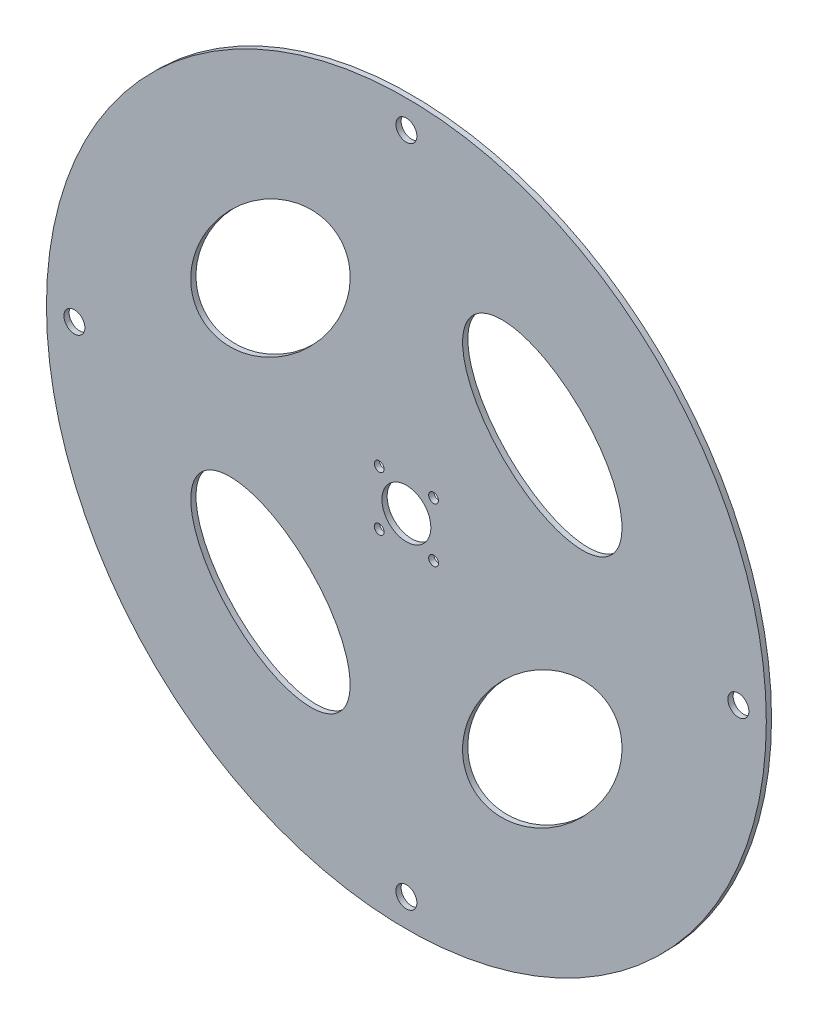
ISO-10303-21;
HEADER;
FILE_DESCRIPTION(('STEP AP214'),'2;1');
FILE_NAME('part.step','',(''),(''),'','','');
FILE_SCHEMA(('AUTOMOTIVE_DESIGN { 1 0 10303 214 1 1 1 1 }'));
ENDSEC;
DATA;
#1=APPLICATION_CONTEXT('core data for automotive mechanical design processes');
#2=APPLICATION_PROTOCOL_DEFINITION('international standard','automotive_design',2000,#1);
#3=PRODUCT_CONTEXT('',#1,'mechanical');
#4=PRODUCT('Part','Part','',(#3));
#5=PRODUCT_RELATED_PRODUCT_CATEGORY('part','',(#4));
#6=PRODUCT_DEFINITION_FORMATION('','',#4);
#7=PRODUCT_DEFINITION_CONTEXT('part definition',#1,'design');
#8=PRODUCT_DEFINITION('design','',#6,#7);
#9=PRODUCT_DEFINITION_SHAPE('','',#8);
#10=(LENGTH_UNIT() NAMED_UNIT(*) SI_UNIT(.MILLI.,.METRE.));
#11=(NAMED_UNIT(*) PLANE_ANGLE_UNIT() SI_UNIT($,.RADIAN.));
#12=(NAMED_UNIT(*) SI_UNIT($,.STERADIAN.) SOLID_ANGLE_UNIT());
#13=UNCERTAINTY_MEASURE_WITH_UNIT(LENGTH_MEASURE(1.E-05),#10,'distance_accuracy_value','');
#14=(GEOMETRIC_REPRESENTATION_CONTEXT(3) GLOBAL_UNCERTAINTY_ASSIGNED_CONTEXT((#13)) GLOBAL_UNIT_ASSIGNED_CONTEXT((#10,
#11,#12)) REPRESENTATION_CONTEXT('',''));
#15=CARTESIAN_POINT('',(0.,0.,0.));
#16=DIRECTION('',(0.,0.,1.));
#17=DIRECTION('',(1.,0.,0.));
#18=AXIS2_PLACEMENT_3D('',#15,#16,#17);
#19=CARTESIAN_POINT('',(0.,0.,1.5));
#20=DIRECTION('',(0.,0.,-1.));
#21=DIRECTION('',(-1.,0.,0.));
#22=AXIS2_PLACEMENT_3D('',#19,#20,#21);
#23=CYLINDRICAL_SURFACE('',#22,103.);
#24=CARTESIAN_POINT('',(0.,0.,1.5));
#25=DIRECTION('',(0.,0.,1.));
#26=DIRECTION('',(1.,0.,0.));
#27=AXIS2_PLACEMENT_3D('',#24,#25,#26);
#28=CIRCLE('',#27,103.);
#29=CARTESIAN_POINT('',(103.,0.,1.5));
#30=VERTEX_POINT('',#29);
#31=EDGE_CURVE('E10',#30,#30,#28,.T.);
#32=ORIENTED_EDGE('',*,*,#31,.F.);
#33=EDGE_LOOP('',(#32));
#34=FACE_BOUND('',#33,.T.);
#35=CARTESIAN_POINT('',(0.,0.,0.));
#36=DIRECTION('',(0.,0.,1.));
#37=DIRECTION('',(1.,0.,0.));
#38=AXIS2_PLACEMENT_3D('',#35,#36,#37);
#39=CIRCLE('',#38,103.);
#40=CARTESIAN_POINT('',(103.,0.,0.));
#41=VERTEX_POINT('',#40);
#42=EDGE_CURVE('E37',#41,#41,#39,.T.);
#43=ORIENTED_EDGE('',*,*,#42,.T.);
#44=EDGE_LOOP('',(#43));
#45=FACE_BOUND('',#44,.T.);
#46=ADVANCED_FACE('F40',(#34,#45),#23,.T.);
#47=CARTESIAN_POINT('',(0.,0.,1.5));
#48=DIRECTION('',(0.,0.,1.));
#49=DIRECTION('',(1.,0.,0.));
#50=AXIS2_PLACEMENT_3D('',#47,#48,#49);
#51=PLANE('',#50);
#52=CARTESIAN_POINT('',(7.77817459305194,-7.7781745930521,1.5));
#53=DIRECTION('',(0.,0.,1.));
#54=DIRECTION('',(1.,0.,0.));
#55=AXIS2_PLACEMENT_3D('',#52,#53,#54);
#56=CIRCLE('',#55,1.4);
#57=CARTESIAN_POINT('',(9.17817459305194,-7.7781745930521,1.5));
#58=VERTEX_POINT('',#57);
#59=EDGE_CURVE('E105',#58,#58,#56,.T.);
#60=ORIENTED_EDGE('',*,*,#59,.F.);
#61=EDGE_LOOP('',(#60));
#62=FACE_BOUND('',#61,.T.);
#63=CARTESIAN_POINT('',(7.77817459305208,7.77817459305197,1.5));
#64=DIRECTION('',(0.,0.,1.));
#65=DIRECTION('',(1.,0.,0.));
#66=AXIS2_PLACEMENT_3D('',#63,#64,#65);
#67=CIRCLE('',#66,1.4);
#68=CARTESIAN_POINT('',(9.17817459305208,7.77817459305197,1.5));
#69=VERTEX_POINT('',#68);
#70=EDGE_CURVE('E112',#69,#69,#67,.T.);
#71=ORIENTED_EDGE('',*,*,#70,.F.);
#72=EDGE_LOOP('',(#71));
#73=FACE_BOUND('',#72,.T.);
#74=CARTESIAN_POINT('',(-7.77817459305199,7.77817459305205,1.5));
#75=DIRECTION('',(0.,0.,1.));
#76=DIRECTION('',(1.,0.,0.));
#77=AXIS2_PLACEMENT_3D('',#74,#75,#76);
#78=CIRCLE('',#77,1.4);
#79=CARTESIAN_POINT('',(-6.378174593052,7.77817459305205,1.5));
#80=VERTEX_POINT('',#79);
#81=EDGE_CURVE('E110',#80,#80,#78,.T.);
#82=ORIENTED_EDGE('',*,*,#81,.F.);
#83=EDGE_LOOP('',(#82));
#84=FACE_BOUND('',#83,.T.);
#85=CARTESIAN_POINT('',(-7.77817459305202,-7.77817459305202,1.5));
#86=DIRECTION('',(0.,0.,1.));
#87=DIRECTION('',(1.,0.,0.));
#88=AXIS2_PLACEMENT_3D('',#85,#86,#87);
#89=CIRCLE('',#88,1.4);
#90=CARTESIAN_POINT('',(-6.37817459305202,-7.77817459305202,1.5));
#91=VERTEX_POINT('',#90);
#92=EDGE_CURVE('E125',#91,#91,#89,.T.);
#93=ORIENTED_EDGE('',*,*,#92,.F.);
#94=EDGE_LOOP('',(#93));
#95=FACE_BOUND('',#94,.T.);
#96=CARTESIAN_POINT('',(38.8908729652602,38.89087296526,1.5));
#97=DIRECTION('',(0.,0.,-1.));
#98=DIRECTION('',(0.707106781186545,-0.70710678118655,0.));
#99=AXIS2_PLACEMENT_3D('',#96,#97,#98);
#100=ELLIPSE('',#99,28.,16.);
#101=CARTESIAN_POINT('',(58.6898628384835,19.0918830920366,1.5));
#102=VERTEX_POINT('',#101);
#103=EDGE_CURVE('E127',#102,#102,#100,.T.);
#104=ORIENTED_EDGE('',*,*,#103,.T.);
#105=EDGE_LOOP('',(#104));
#106=FACE_BOUND('',#105,.T.);
#107=CARTESIAN_POINT('',(38.8908729652601,-38.8908729652601,1.5));
#108=DIRECTION('',(0.,0.,-1.));
#109=DIRECTION('',(-0.707106781186547,-0.707106781186548,0.));
#110=AXIS2_PLACEMENT_3D('',#107,#108,#109);
#111=ELLIPSE('',#110,28.,16.);
#112=CARTESIAN_POINT('',(19.0918830920368,-58.6898628384834,1.5));
#113=VERTEX_POINT('',#112);
#114=EDGE_CURVE('E149',#113,#113,#111,.T.);
#115=ORIENTED_EDGE('',*,*,#114,.T.);
#116=EDGE_LOOP('',(#115));
#117=FACE_BOUND('',#116,.T.);
#118=CARTESIAN_POINT('',(-38.8908729652605,-38.8908729652597,1.5));
#119=DIRECTION('',(0.,0.,-1.));
#120=DIRECTION('',(-0.70710678118654,0.707106781186555,0.));
#121=AXIS2_PLACEMENT_3D('',#118,#119,#120);
#122=ELLIPSE('',#121,28.,16.);
#123=CARTESIAN_POINT('',(-58.6898628384836,-19.0918830920362,1.5));
#124=VERTEX_POINT('',#123);
#125=EDGE_CURVE('E154',#124,#124,#122,.T.);
#126=ORIENTED_EDGE('',*,*,#125,.T.);
#127=EDGE_LOOP('',(#126));
#128=FACE_BOUND('',#127,.T.);
#129=CARTESIAN_POINT('',(3.31690727190098E-13,95.,1.5));
#130=DIRECTION('',(0.,0.,-1.));
#131=DIRECTION('',(0.,1.,0.));
#132=AXIS2_PLACEMENT_3D('',#129,#130,#131);
#133=CIRCLE('',#132,3.00000000000001);
#134=CARTESIAN_POINT('',(3.42165171206627E-13,98.,1.5));
#135=VERTEX_POINT('',#134);
#136=EDGE_CURVE('E59',#135,#135,#133,.T.);
#137=ORIENTED_EDGE('',*,*,#136,.T.);
#138=EDGE_LOOP('',(#137));
#139=FACE_BOUND('',#138,.T.);
#140=CARTESIAN_POINT('',(95.,0.,1.5));
#141=DIRECTION('',(0.,0.,-1.));
#142=DIRECTION('',(1.,0.,0.));
#143=AXIS2_PLACEMENT_3D('',#140,#141,#142);
#144=CIRCLE('',#143,3.00000000000001);
#145=CARTESIAN_POINT('',(98.,0.,1.5));
#146=VERTEX_POINT('',#145);
#147=EDGE_CURVE('E166',#146,#146,#144,.T.);
#148=ORIENTED_EDGE('',*,*,#147,.T.);
#149=EDGE_LOOP('',(#148));
#150=FACE_BOUND('',#149,.T.);
#151=CARTESIAN_POINT('',(-9.95072181570293E-13,-95.,1.5));
#152=DIRECTION('',(0.,0.,-1.));
#153=DIRECTION('',(0.,-1.,0.));
#154=AXIS2_PLACEMENT_3D('',#151,#152,#153);
#155=CIRCLE('',#154,3.00000000000001);
#156=CARTESIAN_POINT('',(-1.02649551361988E-12,-98.,1.5));
#157=VERTEX_POINT('',#156);
#158=EDGE_CURVE('E172',#157,#157,#155,.T.);
#159=ORIENTED_EDGE('',*,*,#158,.T.);
#160=EDGE_LOOP('',(#159));
#161=FACE_BOUND('',#160,.T.);
#162=CARTESIAN_POINT('',(-38.8908729652601,38.8908729652601,1.5));
#163=DIRECTION('',(0.,0.,-1.));
#164=DIRECTION('',(0.707106781186547,0.707106781186548,0.));
#165=AXIS2_PLACEMENT_3D('',#162,#163,#164);
#166=ELLIPSE('',#165,28.,16.);
#167=CARTESIAN_POINT('',(-19.0918830920368,58.6898628384834,1.5));
#168=VERTEX_POINT('',#167);
#169=EDGE_CURVE('E55',#168,#168,#166,.T.);
#170=ORIENTED_EDGE('',*,*,#169,.T.);
#171=EDGE_LOOP('',(#170));
#172=FACE_BOUND('',#171,.T.);
#173=CARTESIAN_POINT('',(-95.,0.,1.5));
#174=DIRECTION('',(0.,0.,-1.));
#175=DIRECTION('',(-1.,0.,0.));
#176=AXIS2_PLACEMENT_3D('',#173,#174,#175);
#177=CIRCLE('',#176,3.00000000000001);
#178=CARTESIAN_POINT('',(-98.,0.,1.5));
#179=VERTEX_POINT('',#178);
#180=EDGE_CURVE('E50',#179,#179,#177,.T.);
#181=ORIENTED_EDGE('',*,*,#180,.T.);
#182=EDGE_LOOP('',(#181));
#183=FACE_BOUND('',#182,.T.);
#184=ORIENTED_EDGE('',*,*,#31,.T.);
#185=EDGE_LOOP('',(#184));
#186=FACE_BOUND('',#185,.T.);
#187=CARTESIAN_POINT('',(0.,0.,1.5));
#188=DIRECTION('',(0.,0.,1.));
#189=DIRECTION('',(1.,0.,0.));
#190=AXIS2_PLACEMENT_3D('',#187,#188,#189);
#191=CIRCLE('',#190,7.);
#192=CARTESIAN_POINT('',(7.,0.,1.5));
#193=VERTEX_POINT('',#192);
#194=EDGE_CURVE('E99',#193,#193,#191,.T.);
#195=ORIENTED_EDGE('',*,*,#194,.F.);
#196=EDGE_LOOP('',(#195));
#197=FACE_BOUND('',#196,.T.);
#198=ADVANCED_FACE('F80',(#62,#73,#84,#95,#106,#117,#128,#139,#150,#161,#172,#183,#186,#197),
#51,.T.);
#199=CARTESIAN_POINT('',(0.,0.,0.));
#200=DIRECTION('',(0.,0.,1.));
#201=DIRECTION('',(1.,0.,0.));
#202=AXIS2_PLACEMENT_3D('',#199,#200,#201);
#203=PLANE('',#202);
#204=CARTESIAN_POINT('',(7.77817459305194,-7.7781745930521,0.));
#205=DIRECTION('',(0.,0.,1.));
#206=DIRECTION('',(1.,0.,0.));
#207=AXIS2_PLACEMENT_3D('',#204,#205,#206);
#208=CIRCLE('',#207,1.4);
#209=CARTESIAN_POINT('',(9.17817459305194,-7.7781745930521,0.));
#210=VERTEX_POINT('',#209);
#211=EDGE_CURVE('E118',#210,#210,#208,.T.);
#212=ORIENTED_EDGE('',*,*,#211,.T.);
#213=EDGE_LOOP('',(#212));
#214=FACE_BOUND('',#213,.T.);
#215=CARTESIAN_POINT('',(7.77817459305208,7.77817459305197,0.));
#216=DIRECTION('',(0.,0.,1.));
#217=DIRECTION('',(1.,0.,0.));
#218=AXIS2_PLACEMENT_3D('',#215,#216,#217);
#219=CIRCLE('',#218,1.4);
#220=CARTESIAN_POINT('',(9.17817459305208,7.77817459305197,0.));
#221=VERTEX_POINT('',#220);
#222=EDGE_CURVE('E115',#221,#221,#219,.T.);
#223=ORIENTED_EDGE('',*,*,#222,.T.);
#224=EDGE_LOOP('',(#223));
#225=FACE_BOUND('',#224,.T.);
#226=CARTESIAN_POINT('',(-7.77817459305199,7.77817459305205,0.));
#227=DIRECTION('',(0.,0.,1.));
#228=DIRECTION('',(1.,0.,0.));
#229=AXIS2_PLACEMENT_3D('',#226,#227,#228);
#230=CIRCLE('',#229,1.4);
#231=CARTESIAN_POINT('',(-6.378174593052,7.77817459305205,0.));
#232=VERTEX_POINT('',#231);
#233=EDGE_CURVE('E104',#232,#232,#230,.T.);
#234=ORIENTED_EDGE('',*,*,#233,.T.);
#235=EDGE_LOOP('',(#234));
#236=FACE_BOUND('',#235,.T.);
#237=CARTESIAN_POINT('',(-7.77817459305202,-7.77817459305202,0.));
#238=DIRECTION('',(0.,0.,1.));
#239=DIRECTION('',(1.,0.,0.));
#240=AXIS2_PLACEMENT_3D('',#237,#238,#239);
#241=CIRCLE('',#240,1.4);
#242=CARTESIAN_POINT('',(-6.37817459305202,-7.77817459305202,0.));
#243=VERTEX_POINT('',#242);
#244=EDGE_CURVE('E106',#243,#243,#241,.T.);
#245=ORIENTED_EDGE('',*,*,#244,.T.);
#246=EDGE_LOOP('',(#245));
#247=FACE_BOUND('',#246,.T.);
#248=CARTESIAN_POINT('',(38.8908729652602,38.89087296526,0.));
#249=DIRECTION('',(0.,0.,-1.));
#250=DIRECTION('',(0.707106781186545,-0.70710678118655,0.));
#251=AXIS2_PLACEMENT_3D('',#248,#249,#250);
#252=ELLIPSE('',#251,28.,16.);
#253=CARTESIAN_POINT('',(58.6898628384835,19.0918830920366,0.));
#254=VERTEX_POINT('',#253);
#255=EDGE_CURVE('E135',#254,#254,#252,.T.);
#256=ORIENTED_EDGE('',*,*,#255,.F.);
#257=EDGE_LOOP('',(#256));
#258=FACE_BOUND('',#257,.T.);
#259=CARTESIAN_POINT('',(38.8908729652601,-38.8908729652601,0.));
#260=DIRECTION('',(0.,0.,-1.));
#261=DIRECTION('',(-0.707106781186547,-0.707106781186548,0.));
#262=AXIS2_PLACEMENT_3D('',#259,#260,#261);
#263=ELLIPSE('',#262,28.,16.);
#264=CARTESIAN_POINT('',(19.0918830920368,-58.6898628384834,0.));
#265=VERTEX_POINT('',#264);
#266=EDGE_CURVE('E152',#265,#265,#263,.T.);
#267=ORIENTED_EDGE('',*,*,#266,.F.);
#268=EDGE_LOOP('',(#267));
#269=FACE_BOUND('',#268,.T.);
#270=CARTESIAN_POINT('',(-38.8908729652605,-38.8908729652597,0.));
#271=DIRECTION('',(0.,0.,-1.));
#272=DIRECTION('',(-0.70710678118654,0.707106781186555,0.));
#273=AXIS2_PLACEMENT_3D('',#270,#271,#272);
#274=ELLIPSE('',#273,28.,16.);
#275=CARTESIAN_POINT('',(-58.6898628384836,-19.0918830920362,0.));
#276=VERTEX_POINT('',#275);
#277=EDGE_CURVE('E124',#276,#276,#274,.T.);
#278=ORIENTED_EDGE('',*,*,#277,.F.);
#279=EDGE_LOOP('',(#278));
#280=FACE_BOUND('',#279,.T.);
#281=CARTESIAN_POINT('',(3.31690727190098E-13,95.,0.));
#282=DIRECTION('',(0.,0.,-1.));
#283=DIRECTION('',(0.,1.,0.));
#284=AXIS2_PLACEMENT_3D('',#281,#282,#283);
#285=CIRCLE('',#284,3.00000000000001);
#286=CARTESIAN_POINT('',(3.42165171206627E-13,98.,0.));
#287=VERTEX_POINT('',#286);
#288=EDGE_CURVE('E165',#287,#287,#285,.T.);
#289=ORIENTED_EDGE('',*,*,#288,.F.);
#290=EDGE_LOOP('',(#289));
#291=FACE_BOUND('',#290,.T.);
#292=CARTESIAN_POINT('',(95.,0.,0.));
#293=DIRECTION('',(0.,0.,-1.));
#294=DIRECTION('',(1.,0.,0.));
#295=AXIS2_PLACEMENT_3D('',#292,#293,#294);
#296=CIRCLE('',#295,3.00000000000001);
#297=CARTESIAN_POINT('',(98.,0.,0.));
#298=VERTEX_POINT('',#297);
#299=EDGE_CURVE('E168',#298,#298,#296,.T.);
#300=ORIENTED_EDGE('',*,*,#299,.F.);
#301=EDGE_LOOP('',(#300));
#302=FACE_BOUND('',#301,.T.);
#303=CARTESIAN_POINT('',(-9.95072181570293E-13,-95.,0.));
#304=DIRECTION('',(0.,0.,-1.));
#305=DIRECTION('',(0.,-1.,0.));
#306=AXIS2_PLACEMENT_3D('',#303,#304,#305);
#307=CIRCLE('',#306,3.00000000000001);
#308=CARTESIAN_POINT('',(-1.02649551361988E-12,-98.,0.));
#309=VERTEX_POINT('',#308);
#310=EDGE_CURVE('E61',#309,#309,#307,.T.);
#311=ORIENTED_EDGE('',*,*,#310,.F.);
#312=EDGE_LOOP('',(#311));
#313=FACE_BOUND('',#312,.T.);
#314=CARTESIAN_POINT('',(-38.8908729652601,38.8908729652601,0.));
#315=DIRECTION('',(0.,0.,-1.));
#316=DIRECTION('',(0.707106781186547,0.707106781186548,0.));
#317=AXIS2_PLACEMENT_3D('',#314,#315,#316);
#318=ELLIPSE('',#317,28.,16.);
#319=CARTESIAN_POINT('',(-19.0918830920368,58.6898628384834,0.));
#320=VERTEX_POINT('',#319);
#321=EDGE_CURVE('E54',#320,#320,#318,.T.);
#322=ORIENTED_EDGE('',*,*,#321,.F.);
#323=EDGE_LOOP('',(#322));
#324=FACE_BOUND('',#323,.T.);
#325=CARTESIAN_POINT('',(-95.,0.,0.));
#326=DIRECTION('',(0.,0.,-1.));
#327=DIRECTION('',(-1.,0.,0.));
#328=AXIS2_PLACEMENT_3D('',#325,#326,#327);
#329=CIRCLE('',#328,3.00000000000001);
#330=CARTESIAN_POINT('',(-98.,0.,0.));
#331=VERTEX_POINT('',#330);
#332=EDGE_CURVE('E47',#331,#331,#329,.T.);
#333=ORIENTED_EDGE('',*,*,#332,.F.);
#334=EDGE_LOOP('',(#333));
#335=FACE_BOUND('',#334,.T.);
#336=ORIENTED_EDGE('',*,*,#42,.F.);
#337=EDGE_LOOP('',(#336));
#338=FACE_BOUND('',#337,.T.);
#339=CARTESIAN_POINT('',(0.,0.,0.));
#340=DIRECTION('',(0.,0.,1.));
#341=DIRECTION('',(1.,0.,0.));
#342=AXIS2_PLACEMENT_3D('',#339,#340,#341);
#343=CIRCLE('',#342,7.);
#344=CARTESIAN_POINT('',(7.,0.,0.));
#345=VERTEX_POINT('',#344);
#346=EDGE_CURVE('E100',#345,#345,#343,.T.);
#347=ORIENTED_EDGE('',*,*,#346,.T.);
#348=EDGE_LOOP('',(#347));
#349=FACE_BOUND('',#348,.T.);
#350=ADVANCED_FACE('F71',(#214,#225,#236,#247,#258,#269,#280,#291,#302,#313,#324,#335,#338,
#349),#203,.F.);
#351=CARTESIAN_POINT('',(-95.,0.,1.5));
#352=DIRECTION('',(0.,0.,-1.));
#353=DIRECTION('',(-1.,0.,0.));
#354=AXIS2_PLACEMENT_3D('',#351,#352,#353);
#355=CYLINDRICAL_SURFACE('',#354,3.00000000000001);
#356=ORIENTED_EDGE('',*,*,#180,.F.);
#357=EDGE_LOOP('',(#356));
#358=FACE_BOUND('',#357,.T.);
#359=ORIENTED_EDGE('',*,*,#332,.T.);
#360=EDGE_LOOP('',(#359));
#361=FACE_BOUND('',#360,.T.);
#362=ADVANCED_FACE('F69',(#358,#361),#355,.F.);
#363=DIRECTION('',(0.,0.,-1.));
#364=VECTOR('',#363,1.);
#365=SURFACE_OF_LINEAR_EXTRUSION('',#166,#364);
#366=ORIENTED_EDGE('',*,*,#169,.F.);
#367=EDGE_LOOP('',(#366));
#368=FACE_BOUND('',#367,.T.);
#369=ORIENTED_EDGE('',*,*,#321,.T.);
#370=EDGE_LOOP('',(#369));
#371=FACE_BOUND('',#370,.T.);
#372=ADVANCED_FACE('F62',(#368,#371),#365,.F.);
#373=CARTESIAN_POINT('',(-9.95072181570293E-13,-95.,1.5));
#374=DIRECTION('',(0.,0.,-1.));
#375=DIRECTION('',(-1.,0.,0.));
#376=AXIS2_PLACEMENT_3D('',#373,#374,#375);
#377=CYLINDRICAL_SURFACE('',#376,3.00000000000001);
#378=ORIENTED_EDGE('',*,*,#158,.F.);
#379=EDGE_LOOP('',(#378));
#380=FACE_BOUND('',#379,.T.);
#381=ORIENTED_EDGE('',*,*,#310,.T.);
#382=EDGE_LOOP('',(#381));
#383=FACE_BOUND('',#382,.T.);
#384=ADVANCED_FACE('F68',(#380,#383),#377,.F.);
#385=CARTESIAN_POINT('',(95.,0.,1.5));
#386=DIRECTION('',(0.,0.,-1.));
#387=DIRECTION('',(-1.,0.,0.));
#388=AXIS2_PLACEMENT_3D('',#385,#386,#387);
#389=CYLINDRICAL_SURFACE('',#388,3.00000000000001);
#390=ORIENTED_EDGE('',*,*,#147,.F.);
#391=EDGE_LOOP('',(#390));
#392=FACE_BOUND('',#391,.T.);
#393=ORIENTED_EDGE('',*,*,#299,.T.);
#394=EDGE_LOOP('',(#393));
#395=FACE_BOUND('',#394,.T.);
#396=ADVANCED_FACE('F188',(#392,#395),#389,.F.);
#397=CARTESIAN_POINT('',(3.31690727190098E-13,95.,1.5));
#398=DIRECTION('',(0.,0.,-1.));
#399=DIRECTION('',(-1.,0.,0.));
#400=AXIS2_PLACEMENT_3D('',#397,#398,#399);
#401=CYLINDRICAL_SURFACE('',#400,3.00000000000001);
#402=ORIENTED_EDGE('',*,*,#136,.F.);
#403=EDGE_LOOP('',(#402));
#404=FACE_BOUND('',#403,.T.);
#405=ORIENTED_EDGE('',*,*,#288,.T.);
#406=EDGE_LOOP('',(#405));
#407=FACE_BOUND('',#406,.T.);
#408=ADVANCED_FACE('F191',(#404,#407),#401,.F.);
#409=DIRECTION('',(0.,0.,-1.));
#410=VECTOR('',#409,1.);
#411=SURFACE_OF_LINEAR_EXTRUSION('',#122,#410);
#412=ORIENTED_EDGE('',*,*,#125,.F.);
#413=EDGE_LOOP('',(#412));
#414=FACE_BOUND('',#413,.T.);
#415=ORIENTED_EDGE('',*,*,#277,.T.);
#416=EDGE_LOOP('',(#415));
#417=FACE_BOUND('',#416,.T.);
#418=ADVANCED_FACE('F144',(#414,#417),#411,.F.);
#419=DIRECTION('',(0.,0.,-1.));
#420=VECTOR('',#419,1.);
#421=SURFACE_OF_LINEAR_EXTRUSION('',#111,#420);
#422=ORIENTED_EDGE('',*,*,#114,.F.);
#423=EDGE_LOOP('',(#422));
#424=FACE_BOUND('',#423,.T.);
#425=ORIENTED_EDGE('',*,*,#266,.T.);
#426=EDGE_LOOP('',(#425));
#427=FACE_BOUND('',#426,.T.);
#428=ADVANCED_FACE('F137',(#424,#427),#421,.F.);
#429=DIRECTION('',(0.,0.,-1.));
#430=VECTOR('',#429,1.);
#431=SURFACE_OF_LINEAR_EXTRUSION('',#100,#430);
#432=ORIENTED_EDGE('',*,*,#103,.F.);
#433=EDGE_LOOP('',(#432));
#434=FACE_BOUND('',#433,.T.);
#435=ORIENTED_EDGE('',*,*,#255,.T.);
#436=EDGE_LOOP('',(#435));
#437=FACE_BOUND('',#436,.T.);
#438=ADVANCED_FACE('F133',(#434,#437),#431,.F.);
#439=CARTESIAN_POINT('',(-7.77817459305202,-7.77817459305202,1.5));
#440=DIRECTION('',(0.,0.,-1.));
#441=DIRECTION('',(-1.,0.,0.));
#442=AXIS2_PLACEMENT_3D('',#439,#440,#441);
#443=CYLINDRICAL_SURFACE('',#442,1.4);
#444=ORIENTED_EDGE('',*,*,#92,.T.);
#445=EDGE_LOOP('',(#444));
#446=FACE_BOUND('',#445,.T.);
#447=ORIENTED_EDGE('',*,*,#244,.F.);
#448=EDGE_LOOP('',(#447));
#449=FACE_BOUND('',#448,.T.);
#450=ADVANCED_FACE('F138',(#446,#449),#443,.F.);
#451=CARTESIAN_POINT('',(-7.77817459305199,7.77817459305205,1.5));
#452=DIRECTION('',(0.,0.,-1.));
#453=DIRECTION('',(-1.,0.,0.));
#454=AXIS2_PLACEMENT_3D('',#451,#452,#453);
#455=CYLINDRICAL_SURFACE('',#454,1.4);
#456=ORIENTED_EDGE('',*,*,#81,.T.);
#457=EDGE_LOOP('',(#456));
#458=FACE_BOUND('',#457,.T.);
#459=ORIENTED_EDGE('',*,*,#233,.F.);
#460=EDGE_LOOP('',(#459));
#461=FACE_BOUND('',#460,.T.);
#462=ADVANCED_FACE('F217',(#458,#461),#455,.F.);
#463=CARTESIAN_POINT('',(7.77817459305208,7.77817459305197,1.5));
#464=DIRECTION('',(0.,0.,-1.));
#465=DIRECTION('',(-1.,0.,0.));
#466=AXIS2_PLACEMENT_3D('',#463,#464,#465);
#467=CYLINDRICAL_SURFACE('',#466,1.4);
#468=ORIENTED_EDGE('',*,*,#70,.T.);
#469=EDGE_LOOP('',(#468));
#470=FACE_BOUND('',#469,.T.);
#471=ORIENTED_EDGE('',*,*,#222,.F.);
#472=EDGE_LOOP('',(#471));
#473=FACE_BOUND('',#472,.T.);
#474=ADVANCED_FACE('F212',(#470,#473),#467,.F.);
#475=CARTESIAN_POINT('',(7.77817459305194,-7.7781745930521,1.5));
#476=DIRECTION('',(0.,0.,-1.));
#477=DIRECTION('',(-1.,0.,0.));
#478=AXIS2_PLACEMENT_3D('',#475,#476,#477);
#479=CYLINDRICAL_SURFACE('',#478,1.4);
#480=ORIENTED_EDGE('',*,*,#59,.T.);
#481=EDGE_LOOP('',(#480));
#482=FACE_BOUND('',#481,.T.);
#483=ORIENTED_EDGE('',*,*,#211,.F.);
#484=EDGE_LOOP('',(#483));
#485=FACE_BOUND('',#484,.T.);
#486=ADVANCED_FACE('F208',(#482,#485),#479,.F.);
#487=CARTESIAN_POINT('',(0.,0.,1.5));
#488=DIRECTION('',(0.,0.,-1.));
#489=DIRECTION('',(-1.,0.,0.));
#490=AXIS2_PLACEMENT_3D('',#487,#488,#489);
#491=CYLINDRICAL_SURFACE('',#490,7.);
#492=ORIENTED_EDGE('',*,*,#194,.T.);
#493=EDGE_LOOP('',(#492));
#494=FACE_BOUND('',#493,.T.);
#495=ORIENTED_EDGE('',*,*,#346,.F.);
#496=EDGE_LOOP('',(#495));
#497=FACE_BOUND('',#496,.T.);
#498=ADVANCED_FACE('F206',(#494,#497),#491,.F.);
#499=CLOSED_SHELL('',(#46,#198,#350,#362,#372,#384,#396,#408,#418,#428,#438,#450,#462,#474,#486,#498));
#500=MANIFOLD_SOLID_BREP('B2',#499);
#501=ADVANCED_BREP_SHAPE_REPRESENTATION('',(#18,#500),#14);
#502=SHAPE_DEFINITION_REPRESENTATION(#9,#501);
ENDSEC;
END-ISO-10303-21;
